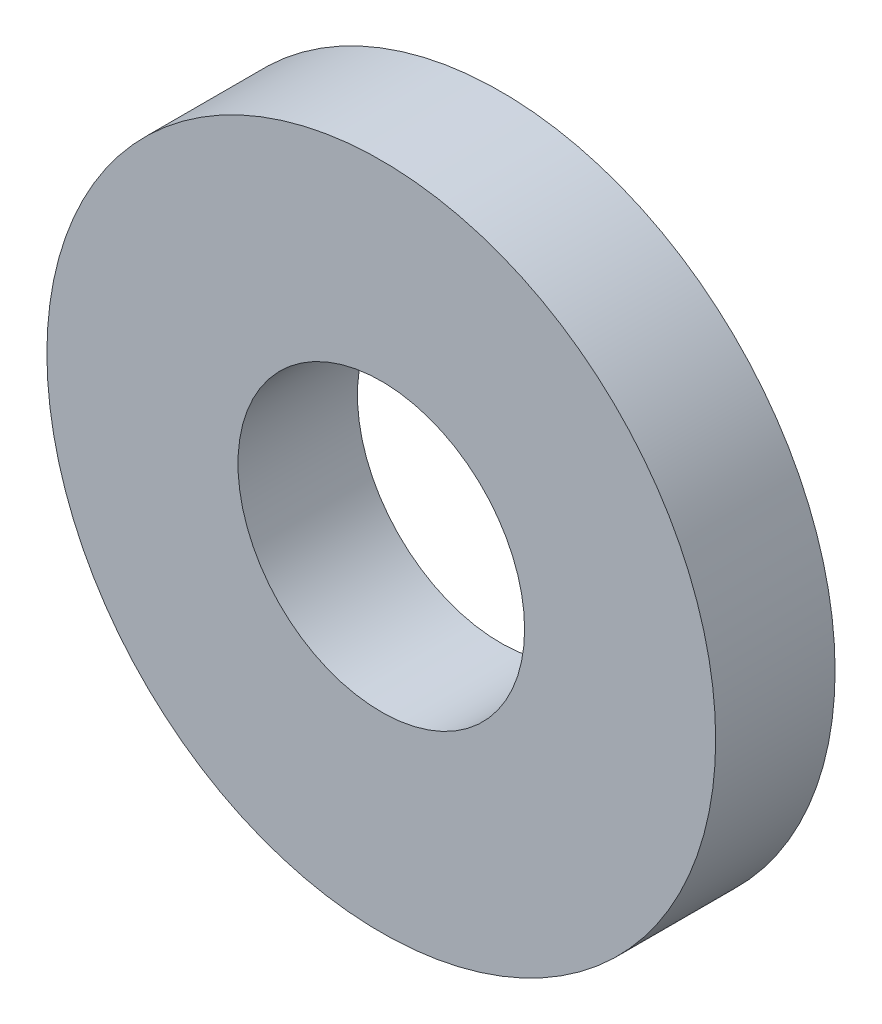
ISO-10303-21;
HEADER;
FILE_DESCRIPTION(('STEP AP214'),'2;1');
FILE_NAME('part.step','',(''),(''),'','','');
FILE_SCHEMA(('AUTOMOTIVE_DESIGN { 1 0 10303 214 1 1 1 1 }'));
ENDSEC;
DATA;
#1=APPLICATION_CONTEXT('core data for automotive mechanical design processes');
#2=APPLICATION_PROTOCOL_DEFINITION('international standard','automotive_design',2000,#1);
#3=PRODUCT_CONTEXT('',#1,'mechanical');
#4=PRODUCT('Part','Part','',(#3));
#5=PRODUCT_RELATED_PRODUCT_CATEGORY('part','',(#4));
#6=PRODUCT_DEFINITION_FORMATION('','',#4);
#7=PRODUCT_DEFINITION_CONTEXT('part definition',#1,'design');
#8=PRODUCT_DEFINITION('design','',#6,#7);
#9=PRODUCT_DEFINITION_SHAPE('','',#8);
#10=(LENGTH_UNIT() NAMED_UNIT(*) SI_UNIT(.MILLI.,.METRE.));
#11=(NAMED_UNIT(*) PLANE_ANGLE_UNIT() SI_UNIT($,.RADIAN.));
#12=(NAMED_UNIT(*) SI_UNIT($,.STERADIAN.) SOLID_ANGLE_UNIT());
#13=UNCERTAINTY_MEASURE_WITH_UNIT(LENGTH_MEASURE(1.E-05),#10,'distance_accuracy_value','');
#14=(GEOMETRIC_REPRESENTATION_CONTEXT(3) GLOBAL_UNCERTAINTY_ASSIGNED_CONTEXT((#13)) GLOBAL_UNIT_ASSIGNED_CONTEXT((#10,
#11,#12)) REPRESENTATION_CONTEXT('',''));
#15=CARTESIAN_POINT('',(0.,0.,0.));
#16=DIRECTION('',(0.,0.,1.));
#17=DIRECTION('',(1.,0.,0.));
#18=AXIS2_PLACEMENT_3D('',#15,#16,#17);
#19=CARTESIAN_POINT('',(0.,0.,3.175));
#20=DIRECTION('',(0.,0.,1.));
#21=DIRECTION('',(1.,0.,0.));
#22=AXIS2_PLACEMENT_3D('',#19,#20,#21);
#23=PLANE('',#22);
#24=CARTESIAN_POINT('',(0.,0.,3.175));
#25=DIRECTION('',(0.,0.,1.));
#26=DIRECTION('',(1.,0.,0.));
#27=AXIS2_PLACEMENT_3D('',#24,#25,#26);
#28=CIRCLE('',#27,8.89);
#29=CARTESIAN_POINT('',(8.89,0.,3.175));
#30=VERTEX_POINT('',#29);
#31=EDGE_CURVE('E10',#30,#30,#28,.T.);
#32=ORIENTED_EDGE('',*,*,#31,.T.);
#33=EDGE_LOOP('',(#32));
#34=FACE_BOUND('',#33,.T.);
#35=CARTESIAN_POINT('',(0.,0.,3.175));
#36=DIRECTION('',(0.,0.,1.));
#37=DIRECTION('',(1.,0.,0.));
#38=AXIS2_PLACEMENT_3D('',#35,#36,#37);
#39=CIRCLE('',#38,3.81);
#40=CARTESIAN_POINT('',(3.81,0.,3.175));
#41=VERTEX_POINT('',#40);
#42=EDGE_CURVE('E50',#41,#41,#39,.T.);
#43=ORIENTED_EDGE('',*,*,#42,.F.);
#44=EDGE_LOOP('',(#43));
#45=FACE_BOUND('',#44,.T.);
#46=ADVANCED_FACE('F37',(#34,#45),#23,.T.);
#47=CARTESIAN_POINT('',(0.,0.,0.));
#48=DIRECTION('',(0.,0.,1.));
#49=DIRECTION('',(1.,0.,0.));
#50=AXIS2_PLACEMENT_3D('',#47,#48,#49);
#51=PLANE('',#50);
#52=CARTESIAN_POINT('',(0.,0.,0.));
#53=DIRECTION('',(0.,0.,1.));
#54=DIRECTION('',(1.,0.,0.));
#55=AXIS2_PLACEMENT_3D('',#52,#53,#54);
#56=CIRCLE('',#55,8.89);
#57=CARTESIAN_POINT('',(8.89,0.,0.));
#58=VERTEX_POINT('',#57);
#59=EDGE_CURVE('E41',#58,#58,#56,.T.);
#60=ORIENTED_EDGE('',*,*,#59,.F.);
#61=EDGE_LOOP('',(#60));
#62=FACE_BOUND('',#61,.T.);
#63=CARTESIAN_POINT('',(0.,0.,0.));
#64=DIRECTION('',(0.,0.,1.));
#65=DIRECTION('',(1.,0.,0.));
#66=AXIS2_PLACEMENT_3D('',#63,#64,#65);
#67=CIRCLE('',#66,3.81);
#68=CARTESIAN_POINT('',(3.81,0.,0.));
#69=VERTEX_POINT('',#68);
#70=EDGE_CURVE('E52',#69,#69,#67,.T.);
#71=ORIENTED_EDGE('',*,*,#70,.T.);
#72=EDGE_LOOP('',(#71));
#73=FACE_BOUND('',#72,.T.);
#74=ADVANCED_FACE('F64',(#62,#73),#51,.F.);
#75=CARTESIAN_POINT('',(0.,0.,3.175));
#76=DIRECTION('',(0.,0.,-1.));
#77=DIRECTION('',(-1.,0.,0.));
#78=AXIS2_PLACEMENT_3D('',#75,#76,#77);
#79=CYLINDRICAL_SURFACE('',#78,8.89);
#80=ORIENTED_EDGE('',*,*,#31,.F.);
#81=EDGE_LOOP('',(#80));
#82=FACE_BOUND('',#81,.T.);
#83=ORIENTED_EDGE('',*,*,#59,.T.);
#84=EDGE_LOOP('',(#83));
#85=FACE_BOUND('',#84,.T.);
#86=ADVANCED_FACE('F39',(#82,#85),#79,.T.);
#87=CARTESIAN_POINT('',(0.,0.,3.175));
#88=DIRECTION('',(0.,0.,-1.));
#89=DIRECTION('',(-1.,0.,0.));
#90=AXIS2_PLACEMENT_3D('',#87,#88,#89);
#91=CYLINDRICAL_SURFACE('',#90,3.81);
#92=ORIENTED_EDGE('',*,*,#42,.T.);
#93=EDGE_LOOP('',(#92));
#94=FACE_BOUND('',#93,.T.);
#95=ORIENTED_EDGE('',*,*,#70,.F.);
#96=EDGE_LOOP('',(#95));
#97=FACE_BOUND('',#96,.T.);
#98=ADVANCED_FACE('F60',(#94,#97),#91,.F.);
#99=CLOSED_SHELL('',(#46,#74,#86,#98));
#100=MANIFOLD_SOLID_BREP('B2',#99);
#101=ADVANCED_BREP_SHAPE_REPRESENTATION('',(#18,#100),#14);
#102=SHAPE_DEFINITION_REPRESENTATION(#9,#101);
ENDSEC;
END-ISO-10303-21;
